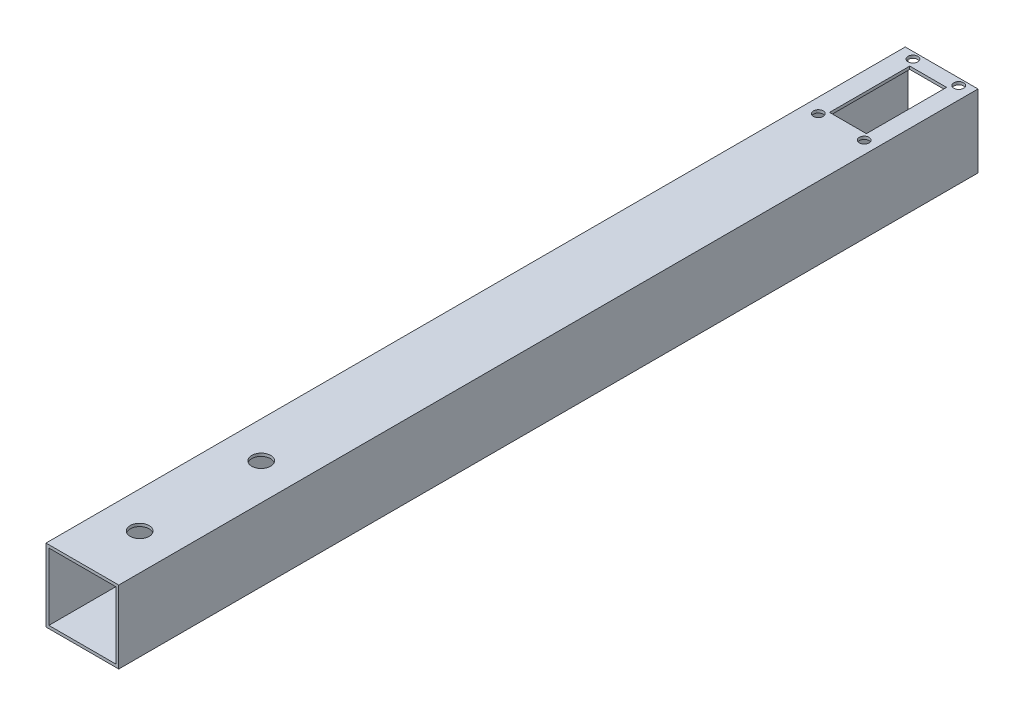
ISO-10303-21;
HEADER;
FILE_DESCRIPTION(('STEP AP214'),'2;1');
FILE_NAME('part.step','',(''),(''),'','','');
FILE_SCHEMA(('AUTOMOTIVE_DESIGN { 1 0 10303 214 1 1 1 1 }'));
ENDSEC;
DATA;
#1=APPLICATION_CONTEXT('core data for automotive mechanical design processes');
#2=APPLICATION_PROTOCOL_DEFINITION('international standard','automotive_design',2000,#1);
#3=PRODUCT_CONTEXT('',#1,'mechanical');
#4=PRODUCT('Part','Part','',(#3));
#5=PRODUCT_RELATED_PRODUCT_CATEGORY('part','',(#4));
#6=PRODUCT_DEFINITION_FORMATION('','',#4);
#7=PRODUCT_DEFINITION_CONTEXT('part definition',#1,'design');
#8=PRODUCT_DEFINITION('design','',#6,#7);
#9=PRODUCT_DEFINITION_SHAPE('','',#8);
#10=(LENGTH_UNIT() NAMED_UNIT(*) SI_UNIT(.MILLI.,.METRE.));
#11=(NAMED_UNIT(*) PLANE_ANGLE_UNIT() SI_UNIT($,.RADIAN.));
#12=(NAMED_UNIT(*) SI_UNIT($,.STERADIAN.) SOLID_ANGLE_UNIT());
#13=UNCERTAINTY_MEASURE_WITH_UNIT(LENGTH_MEASURE(1.E-05),#10,'distance_accuracy_value','');
#14=(GEOMETRIC_REPRESENTATION_CONTEXT(3) GLOBAL_UNCERTAINTY_ASSIGNED_CONTEXT((#13)) GLOBAL_UNIT_ASSIGNED_CONTEXT((#10,
#11,#12)) REPRESENTATION_CONTEXT('',''));
#15=CARTESIAN_POINT('',(0.,0.,0.));
#16=DIRECTION('',(0.,0.,1.));
#17=DIRECTION('',(1.,0.,0.));
#18=AXIS2_PLACEMENT_3D('',#15,#16,#17);
#19=CARTESIAN_POINT('',(-12.7,12.7,300.));
#20=DIRECTION('',(0.,-1.,0.));
#21=DIRECTION('',(0.,0.,-1.));
#22=AXIS2_PLACEMENT_3D('',#19,#20,#21);
#23=PLANE('',#22);
#24=CARTESIAN_POINT('',(8.30000000000014,12.7,2.32003162419413));
#25=DIRECTION('',(0.,1.,0.));
#26=DIRECTION('',(0.,0.,1.));
#27=AXIS2_PLACEMENT_3D('',#24,#25,#26);
#28=CIRCLE('',#27,1.69999999999999);
#29=CARTESIAN_POINT('',(8.30000000000014,12.7,4.02003162419412));
#30=VERTEX_POINT('',#29);
#31=EDGE_CURVE('E304',#30,#30,#28,.T.);
#32=ORIENTED_EDGE('',*,*,#31,.F.);
#33=EDGE_LOOP('',(#32));
#34=FACE_BOUND('',#33,.T.);
#35=CARTESIAN_POINT('',(-7.69999999999986,12.7,2.32003162419413));
#36=DIRECTION('',(0.,1.,0.));
#37=DIRECTION('',(0.,0.,1.));
#38=AXIS2_PLACEMENT_3D('',#35,#36,#37);
#39=CIRCLE('',#38,1.69999999999999);
#40=CARTESIAN_POINT('',(-7.69999999999986,12.7,4.02003162419412));
#41=VERTEX_POINT('',#40);
#42=EDGE_CURVE('E300',#41,#41,#39,.T.);
#43=ORIENTED_EDGE('',*,*,#42,.F.);
#44=EDGE_LOOP('',(#43));
#45=FACE_BOUND('',#44,.T.);
#46=CARTESIAN_POINT('',(-7.69999999999987,12.7,35.3408584723593));
#47=DIRECTION('',(0.,1.,0.));
#48=DIRECTION('',(0.,0.,1.));
#49=AXIS2_PLACEMENT_3D('',#46,#47,#48);
#50=CIRCLE('',#49,1.69999999999999);
#51=CARTESIAN_POINT('',(-7.69999999999987,12.7,37.0408584723593));
#52=VERTEX_POINT('',#51);
#53=EDGE_CURVE('E292',#52,#52,#50,.T.);
#54=ORIENTED_EDGE('',*,*,#53,.F.);
#55=EDGE_LOOP('',(#54));
#56=FACE_BOUND('',#55,.T.);
#57=DIRECTION('',(-1.,0.,0.));
#58=VECTOR('',#57,1.);
#59=CARTESIAN_POINT('',(6.73055637719681,12.7,5.00000000000025));
#60=LINE('',#59,#58);
#61=CARTESIAN_POINT('',(6.73055637719681,12.7,5.00000000000022));
#62=VERTEX_POINT('',#61);
#63=CARTESIAN_POINT('',(-6.13055637719656,12.7,5.00000000000025));
#64=VERTEX_POINT('',#63);
#65=EDGE_CURVE('E141',#62,#64,#60,.T.);
#66=ORIENTED_EDGE('',*,*,#65,.F.);
#67=DIRECTION('',(0.,0.,-1.));
#68=VECTOR('',#67,1.);
#69=CARTESIAN_POINT('',(6.73055637719681,12.7,5.00000000000025));
#70=LINE('',#69,#68);
#71=CARTESIAN_POINT('',(6.73055637719682,12.7,33.0000000000002));
#72=VERTEX_POINT('',#71);
#73=EDGE_CURVE('E55',#72,#62,#70,.T.);
#74=ORIENTED_EDGE('',*,*,#73,.F.);
#75=DIRECTION('',(1.,0.,0.));
#76=VECTOR('',#75,1.);
#77=CARTESIAN_POINT('',(6.73055637719682,12.7,33.0000000000002));
#78=LINE('',#77,#76);
#79=CARTESIAN_POINT('',(-6.13055637719656,12.7,33.0000000000002));
#80=VERTEX_POINT('',#79);
#81=EDGE_CURVE('E148',#80,#72,#78,.T.);
#82=ORIENTED_EDGE('',*,*,#81,.F.);
#83=DIRECTION('',(0.,0.,1.));
#84=VECTOR('',#83,1.);
#85=CARTESIAN_POINT('',(-6.13055637719656,12.7,5.00000000000025));
#86=LINE('',#85,#84);
#87=EDGE_CURVE('E131',#64,#80,#86,.T.);
#88=ORIENTED_EDGE('',*,*,#87,.F.);
#89=EDGE_LOOP('',(#66,#74,#82,#88));
#90=FACE_BOUND('',#89,.T.);
#91=CARTESIAN_POINT('',(0.,12.7,280.));
#92=DIRECTION('',(0.,1.,0.));
#93=DIRECTION('',(0.,0.,1.));
#94=AXIS2_PLACEMENT_3D('',#91,#92,#93);
#95=CIRCLE('',#94,3.29999999999999);
#96=CARTESIAN_POINT('',(0.,12.7,283.3));
#97=VERTEX_POINT('',#96);
#98=EDGE_CURVE('E158',#97,#97,#95,.T.);
#99=ORIENTED_EDGE('',*,*,#98,.F.);
#100=EDGE_LOOP('',(#99));
#101=FACE_BOUND('',#100,.T.);
#102=CARTESIAN_POINT('',(0.,12.7,237.57));
#103=DIRECTION('',(0.,1.,0.));
#104=DIRECTION('',(0.,0.,1.));
#105=AXIS2_PLACEMENT_3D('',#102,#103,#104);
#106=CIRCLE('',#105,3.29999999999999);
#107=CARTESIAN_POINT('',(0.,12.7,240.87));
#108=VERTEX_POINT('',#107);
#109=EDGE_CURVE('E170',#108,#108,#106,.T.);
#110=ORIENTED_EDGE('',*,*,#109,.F.);
#111=EDGE_LOOP('',(#110));
#112=FACE_BOUND('',#111,.T.);
#113=DIRECTION('',(-1.,0.,0.));
#114=VECTOR('',#113,1.);
#115=CARTESIAN_POINT('',(-12.7,12.7,0.));
#116=LINE('',#115,#114);
#117=CARTESIAN_POINT('',(12.7,12.7,0.));
#118=VERTEX_POINT('',#117);
#119=CARTESIAN_POINT('',(-12.7,12.7,0.));
#120=VERTEX_POINT('',#119);
#121=EDGE_CURVE('E240',#118,#120,#116,.T.);
#122=ORIENTED_EDGE('',*,*,#121,.T.);
#123=DIRECTION('',(0.,0.,-1.));
#124=VECTOR('',#123,1.);
#125=CARTESIAN_POINT('',(-12.7,12.7,300.));
#126=LINE('',#125,#124);
#127=CARTESIAN_POINT('',(-12.7,12.7,300.));
#128=VERTEX_POINT('',#127);
#129=EDGE_CURVE('E255',#128,#120,#126,.T.);
#130=ORIENTED_EDGE('',*,*,#129,.F.);
#131=DIRECTION('',(-1.,0.,0.));
#132=VECTOR('',#131,1.);
#133=CARTESIAN_POINT('',(-12.7,12.7,300.));
#134=LINE('',#133,#132);
#135=CARTESIAN_POINT('',(12.7,12.7,300.));
#136=VERTEX_POINT('',#135);
#137=EDGE_CURVE('E226',#136,#128,#134,.T.);
#138=ORIENTED_EDGE('',*,*,#137,.F.);
#139=DIRECTION('',(0.,0.,-1.));
#140=VECTOR('',#139,1.);
#141=CARTESIAN_POINT('',(12.7,12.7,300.));
#142=LINE('',#141,#140);
#143=EDGE_CURVE('E259',#136,#118,#142,.T.);
#144=ORIENTED_EDGE('',*,*,#143,.T.);
#145=EDGE_LOOP('',(#122,#130,#138,#144));
#146=FACE_BOUND('',#145,.T.);
#147=CARTESIAN_POINT('',(8.30000000000013,12.7,35.3408584723594));
#148=DIRECTION('',(0.,1.,0.));
#149=DIRECTION('',(0.,0.,1.));
#150=AXIS2_PLACEMENT_3D('',#147,#148,#149);
#151=CIRCLE('',#150,1.69999999999999);
#152=CARTESIAN_POINT('',(8.30000000000013,12.7,37.0408584723593));
#153=VERTEX_POINT('',#152);
#154=EDGE_CURVE('E282',#153,#153,#151,.T.);
#155=ORIENTED_EDGE('',*,*,#154,.F.);
#156=EDGE_LOOP('',(#155));
#157=FACE_BOUND('',#156,.T.);
#158=ADVANCED_FACE('F38',(#34,#45,#56,#90,#101,#112,#146,#157),#23,.F.);
#159=CARTESIAN_POINT('',(0.,0.,300.));
#160=DIRECTION('',(0.,0.,1.));
#161=DIRECTION('',(1.,0.,0.));
#162=AXIS2_PLACEMENT_3D('',#159,#160,#161);
#163=PLANE('',#162);
#164=DIRECTION('',(0.,1.,0.));
#165=VECTOR('',#164,1.);
#166=CARTESIAN_POINT('',(12.7,12.7,300.));
#167=LINE('',#166,#165);
#168=CARTESIAN_POINT('',(12.7,-12.7,300.));
#169=VERTEX_POINT('',#168);
#170=EDGE_CURVE('E222',#169,#136,#167,.T.);
#171=ORIENTED_EDGE('',*,*,#170,.T.);
#172=ORIENTED_EDGE('',*,*,#137,.T.);
#173=DIRECTION('',(0.,-1.,0.));
#174=VECTOR('',#173,1.);
#175=CARTESIAN_POINT('',(-12.7,12.7,300.));
#176=LINE('',#175,#174);
#177=CARTESIAN_POINT('',(-12.7,-12.7,300.));
#178=VERTEX_POINT('',#177);
#179=EDGE_CURVE('E230',#128,#178,#176,.T.);
#180=ORIENTED_EDGE('',*,*,#179,.T.);
#181=DIRECTION('',(1.,0.,0.));
#182=VECTOR('',#181,1.);
#183=CARTESIAN_POINT('',(-12.7,-12.7,300.));
#184=LINE('',#183,#182);
#185=EDGE_CURVE('E233',#178,#169,#184,.T.);
#186=ORIENTED_EDGE('',*,*,#185,.T.);
#187=EDGE_LOOP('',(#171,#172,#180,#186));
#188=FACE_BOUND('',#187,.T.);
#189=DIRECTION('',(-1.,0.,0.));
#190=VECTOR('',#189,1.);
#191=CARTESIAN_POINT('',(-11.7,11.7,300.));
#192=LINE('',#191,#190);
#193=CARTESIAN_POINT('',(11.7,11.7,300.));
#194=VERTEX_POINT('',#193);
#195=CARTESIAN_POINT('',(-11.7,11.7,300.));
#196=VERTEX_POINT('',#195);
#197=EDGE_CURVE('E182',#194,#196,#192,.T.);
#198=ORIENTED_EDGE('',*,*,#197,.F.);
#199=DIRECTION('',(0.,1.,0.));
#200=VECTOR('',#199,1.);
#201=CARTESIAN_POINT('',(11.7,11.7,300.));
#202=LINE('',#201,#200);
#203=CARTESIAN_POINT('',(11.7,-11.7,300.));
#204=VERTEX_POINT('',#203);
#205=EDGE_CURVE('E179',#204,#194,#202,.T.);
#206=ORIENTED_EDGE('',*,*,#205,.F.);
#207=DIRECTION('',(1.,0.,0.));
#208=VECTOR('',#207,1.);
#209=CARTESIAN_POINT('',(-11.7,-11.7,300.));
#210=LINE('',#209,#208);
#211=CARTESIAN_POINT('',(-11.7,-11.7,300.));
#212=VERTEX_POINT('',#211);
#213=EDGE_CURVE('E190',#212,#204,#210,.T.);
#214=ORIENTED_EDGE('',*,*,#213,.F.);
#215=DIRECTION('',(0.,-1.,0.));
#216=VECTOR('',#215,1.);
#217=CARTESIAN_POINT('',(-11.7,11.7,300.));
#218=LINE('',#217,#216);
#219=EDGE_CURVE('E186',#196,#212,#218,.T.);
#220=ORIENTED_EDGE('',*,*,#219,.F.);
#221=EDGE_LOOP('',(#198,#206,#214,#220));
#222=FACE_BOUND('',#221,.T.);
#223=ADVANCED_FACE('F334',(#188,#222),#163,.T.);
#224=CARTESIAN_POINT('',(0.,0.,0.));
#225=DIRECTION('',(0.,0.,1.));
#226=DIRECTION('',(1.,0.,0.));
#227=AXIS2_PLACEMENT_3D('',#224,#225,#226);
#228=PLANE('',#227);
#229=DIRECTION('',(0.,1.,0.));
#230=VECTOR('',#229,1.);
#231=CARTESIAN_POINT('',(12.7,12.7,0.));
#232=LINE('',#231,#230);
#233=CARTESIAN_POINT('',(12.7,-12.7,0.));
#234=VERTEX_POINT('',#233);
#235=EDGE_CURVE('E221',#234,#118,#232,.T.);
#236=ORIENTED_EDGE('',*,*,#235,.F.);
#237=DIRECTION('',(1.,0.,0.));
#238=VECTOR('',#237,1.);
#239=CARTESIAN_POINT('',(-12.7,-12.7,0.));
#240=LINE('',#239,#238);
#241=CARTESIAN_POINT('',(-12.7,-12.7,0.));
#242=VERTEX_POINT('',#241);
#243=EDGE_CURVE('E227',#242,#234,#240,.T.);
#244=ORIENTED_EDGE('',*,*,#243,.F.);
#245=DIRECTION('',(0.,-1.,0.));
#246=VECTOR('',#245,1.);
#247=CARTESIAN_POINT('',(-12.7,12.7,0.));
#248=LINE('',#247,#246);
#249=EDGE_CURVE('E243',#120,#242,#248,.T.);
#250=ORIENTED_EDGE('',*,*,#249,.F.);
#251=ORIENTED_EDGE('',*,*,#121,.F.);
#252=EDGE_LOOP('',(#236,#244,#250,#251));
#253=FACE_BOUND('',#252,.T.);
#254=DIRECTION('',(0.,1.,0.));
#255=VECTOR('',#254,1.);
#256=CARTESIAN_POINT('',(11.7,11.7,0.));
#257=LINE('',#256,#255);
#258=CARTESIAN_POINT('',(11.7,-11.7,0.));
#259=VERTEX_POINT('',#258);
#260=CARTESIAN_POINT('',(11.7,11.7,0.));
#261=VERTEX_POINT('',#260);
#262=EDGE_CURVE('E178',#259,#261,#257,.T.);
#263=ORIENTED_EDGE('',*,*,#262,.T.);
#264=DIRECTION('',(-1.,0.,0.));
#265=VECTOR('',#264,1.);
#266=CARTESIAN_POINT('',(-11.7,11.7,0.));
#267=LINE('',#266,#265);
#268=CARTESIAN_POINT('',(-11.7,11.7,0.));
#269=VERTEX_POINT('',#268);
#270=EDGE_CURVE('E197',#261,#269,#267,.T.);
#271=ORIENTED_EDGE('',*,*,#270,.T.);
#272=DIRECTION('',(0.,-1.,0.));
#273=VECTOR('',#272,1.);
#274=CARTESIAN_POINT('',(-11.7,11.7,0.));
#275=LINE('',#274,#273);
#276=CARTESIAN_POINT('',(-11.7,-11.7,0.));
#277=VERTEX_POINT('',#276);
#278=EDGE_CURVE('E201',#269,#277,#275,.T.);
#279=ORIENTED_EDGE('',*,*,#278,.T.);
#280=DIRECTION('',(1.,0.,0.));
#281=VECTOR('',#280,1.);
#282=CARTESIAN_POINT('',(-11.7,-11.7,0.));
#283=LINE('',#282,#281);
#284=EDGE_CURVE('E183',#277,#259,#283,.T.);
#285=ORIENTED_EDGE('',*,*,#284,.T.);
#286=EDGE_LOOP('',(#263,#271,#279,#285));
#287=FACE_BOUND('',#286,.T.);
#288=ADVANCED_FACE('F340',(#253,#287),#228,.F.);
#289=CARTESIAN_POINT('',(12.7,12.7,300.));
#290=DIRECTION('',(-1.,0.,0.));
#291=DIRECTION('',(0.,0.,1.));
#292=AXIS2_PLACEMENT_3D('',#289,#290,#291);
#293=PLANE('',#292);
#294=ORIENTED_EDGE('',*,*,#235,.T.);
#295=ORIENTED_EDGE('',*,*,#143,.F.);
#296=ORIENTED_EDGE('',*,*,#170,.F.);
#297=DIRECTION('',(0.,0.,-1.));
#298=VECTOR('',#297,1.);
#299=CARTESIAN_POINT('',(12.7,-12.7,300.));
#300=LINE('',#299,#298);
#301=EDGE_CURVE('E236',#169,#234,#300,.T.);
#302=ORIENTED_EDGE('',*,*,#301,.T.);
#303=EDGE_LOOP('',(#294,#295,#296,#302));
#304=FACE_BOUND('',#303,.T.);
#305=ADVANCED_FACE('F40',(#304),#293,.F.);
#306=CARTESIAN_POINT('',(-12.7,12.7,300.));
#307=DIRECTION('',(1.,0.,0.));
#308=DIRECTION('',(0.,1.,0.));
#309=AXIS2_PLACEMENT_3D('',#306,#307,#308);
#310=PLANE('',#309);
#311=ORIENTED_EDGE('',*,*,#249,.T.);
#312=DIRECTION('',(0.,0.,-1.));
#313=VECTOR('',#312,1.);
#314=CARTESIAN_POINT('',(-12.7,-12.7,300.));
#315=LINE('',#314,#313);
#316=EDGE_CURVE('E251',#178,#242,#315,.T.);
#317=ORIENTED_EDGE('',*,*,#316,.F.);
#318=ORIENTED_EDGE('',*,*,#179,.F.);
#319=ORIENTED_EDGE('',*,*,#129,.T.);
#320=EDGE_LOOP('',(#311,#317,#318,#319));
#321=FACE_BOUND('',#320,.T.);
#322=ADVANCED_FACE('F345',(#321),#310,.F.);
#323=CARTESIAN_POINT('',(-12.7,-12.7,300.));
#324=DIRECTION('',(0.,1.,0.));
#325=DIRECTION('',(0.,0.,1.));
#326=AXIS2_PLACEMENT_3D('',#323,#324,#325);
#327=PLANE('',#326);
#328=ORIENTED_EDGE('',*,*,#243,.T.);
#329=ORIENTED_EDGE('',*,*,#301,.F.);
#330=ORIENTED_EDGE('',*,*,#185,.F.);
#331=ORIENTED_EDGE('',*,*,#316,.T.);
#332=EDGE_LOOP('',(#328,#329,#330,#331));
#333=FACE_BOUND('',#332,.T.);
#334=ADVANCED_FACE('F348',(#333),#327,.F.);
#335=CARTESIAN_POINT('',(11.7,11.7,300.));
#336=DIRECTION('',(-1.,0.,0.));
#337=DIRECTION('',(0.,-1.,0.));
#338=AXIS2_PLACEMENT_3D('',#335,#336,#337);
#339=PLANE('',#338);
#340=ORIENTED_EDGE('',*,*,#262,.F.);
#341=DIRECTION('',(0.,0.,-1.));
#342=VECTOR('',#341,1.);
#343=CARTESIAN_POINT('',(11.7,-11.7,300.));
#344=LINE('',#343,#342);
#345=EDGE_CURVE('E193',#204,#259,#344,.T.);
#346=ORIENTED_EDGE('',*,*,#345,.F.);
#347=ORIENTED_EDGE('',*,*,#205,.T.);
#348=DIRECTION('',(0.,0.,-1.));
#349=VECTOR('',#348,1.);
#350=CARTESIAN_POINT('',(11.7,11.7,300.));
#351=LINE('',#350,#349);
#352=EDGE_CURVE('E217',#194,#261,#351,.T.);
#353=ORIENTED_EDGE('',*,*,#352,.T.);
#354=EDGE_LOOP('',(#340,#346,#347,#353));
#355=FACE_BOUND('',#354,.T.);
#356=ADVANCED_FACE('F318',(#355),#339,.T.);
#357=CARTESIAN_POINT('',(-11.7,11.7,300.));
#358=DIRECTION('',(0.,-1.,0.));
#359=DIRECTION('',(0.,0.,-1.));
#360=AXIS2_PLACEMENT_3D('',#357,#358,#359);
#361=PLANE('',#360);
#362=CARTESIAN_POINT('',(8.30000000000014,11.7,2.32003162419413));
#363=DIRECTION('',(0.,-1.,0.));
#364=DIRECTION('',(0.,0.,-1.));
#365=AXIS2_PLACEMENT_3D('',#362,#363,#364);
#366=CIRCLE('',#365,1.69999999999999);
#367=CARTESIAN_POINT('',(8.30000000000014,11.7,0.620031624194145));
#368=VERTEX_POINT('',#367);
#369=EDGE_CURVE('E42',#368,#368,#366,.T.);
#370=ORIENTED_EDGE('',*,*,#369,.F.);
#371=EDGE_LOOP('',(#370));
#372=FACE_BOUND('',#371,.T.);
#373=CARTESIAN_POINT('',(-7.69999999999986,11.7,2.32003162419413));
#374=DIRECTION('',(0.,-1.,0.));
#375=DIRECTION('',(0.,0.,-1.));
#376=AXIS2_PLACEMENT_3D('',#373,#374,#375);
#377=CIRCLE('',#376,1.69999999999999);
#378=CARTESIAN_POINT('',(-7.69999999999986,11.7,0.620031624194138));
#379=VERTEX_POINT('',#378);
#380=EDGE_CURVE('E296',#379,#379,#377,.T.);
#381=ORIENTED_EDGE('',*,*,#380,.F.);
#382=EDGE_LOOP('',(#381));
#383=FACE_BOUND('',#382,.T.);
#384=CARTESIAN_POINT('',(-7.69999999999987,11.7,35.3408584723593));
#385=DIRECTION('',(0.,-1.,0.));
#386=DIRECTION('',(0.,0.,-1.));
#387=AXIS2_PLACEMENT_3D('',#384,#385,#386);
#388=CIRCLE('',#387,1.69999999999999);
#389=CARTESIAN_POINT('',(-7.69999999999987,11.7,33.6408584723594));
#390=VERTEX_POINT('',#389);
#391=EDGE_CURVE('E288',#390,#390,#388,.T.);
#392=ORIENTED_EDGE('',*,*,#391,.F.);
#393=EDGE_LOOP('',(#392));
#394=FACE_BOUND('',#393,.T.);
#395=CARTESIAN_POINT('',(8.30000000000013,11.7,35.3408584723594));
#396=DIRECTION('',(0.,-1.,0.));
#397=DIRECTION('',(0.,0.,-1.));
#398=AXIS2_PLACEMENT_3D('',#395,#396,#397);
#399=CIRCLE('',#398,1.69999999999999);
#400=CARTESIAN_POINT('',(8.30000000000013,11.7,33.6408584723594));
#401=VERTEX_POINT('',#400);
#402=EDGE_CURVE('E279',#401,#401,#399,.T.);
#403=ORIENTED_EDGE('',*,*,#402,.F.);
#404=EDGE_LOOP('',(#403));
#405=FACE_BOUND('',#404,.T.);
#406=DIRECTION('',(0.,0.,1.));
#407=VECTOR('',#406,1.);
#408=CARTESIAN_POINT('',(6.73055637719685,11.7,300.));
#409=LINE('',#408,#407);
#410=CARTESIAN_POINT('',(6.73055637719681,11.7,5.00000000000025));
#411=VERTEX_POINT('',#410);
#412=CARTESIAN_POINT('',(6.73055637719682,11.7,33.0000000000002));
#413=VERTEX_POINT('',#412);
#414=EDGE_CURVE('E11',#411,#413,#409,.T.);
#415=ORIENTED_EDGE('',*,*,#414,.F.);
#416=DIRECTION('',(1.,0.,0.));
#417=VECTOR('',#416,1.);
#418=CARTESIAN_POINT('',(-11.7,11.7,5.00000000000023));
#419=LINE('',#418,#417);
#420=CARTESIAN_POINT('',(-6.13055637719656,11.7,5.00000000000023));
#421=VERTEX_POINT('',#420);
#422=EDGE_CURVE('E263',#421,#411,#419,.T.);
#423=ORIENTED_EDGE('',*,*,#422,.F.);
#424=DIRECTION('',(0.,0.,-1.));
#425=VECTOR('',#424,1.);
#426=CARTESIAN_POINT('',(-6.13055637719651,11.7,300.));
#427=LINE('',#426,#425);
#428=CARTESIAN_POINT('',(-6.13055637719656,11.7,33.0000000000002));
#429=VERTEX_POINT('',#428);
#430=EDGE_CURVE('E134',#429,#421,#427,.T.);
#431=ORIENTED_EDGE('',*,*,#430,.F.);
#432=DIRECTION('',(-1.,0.,0.));
#433=VECTOR('',#432,1.);
#434=CARTESIAN_POINT('',(-11.7,11.7,33.0000000000002));
#435=LINE('',#434,#433);
#436=EDGE_CURVE('E48',#413,#429,#435,.T.);
#437=ORIENTED_EDGE('',*,*,#436,.F.);
#438=EDGE_LOOP('',(#415,#423,#431,#437));
#439=FACE_BOUND('',#438,.T.);
#440=CARTESIAN_POINT('',(0.,11.7,280.));
#441=DIRECTION('',(0.,-1.,0.));
#442=DIRECTION('',(0.,0.,-1.));
#443=AXIS2_PLACEMENT_3D('',#440,#441,#442);
#444=CIRCLE('',#443,3.29999999999999);
#445=CARTESIAN_POINT('',(0.,11.7,276.7));
#446=VERTEX_POINT('',#445);
#447=EDGE_CURVE('E166',#446,#446,#444,.T.);
#448=ORIENTED_EDGE('',*,*,#447,.F.);
#449=EDGE_LOOP('',(#448));
#450=FACE_BOUND('',#449,.T.);
#451=CARTESIAN_POINT('',(0.,11.7,237.57));
#452=DIRECTION('',(0.,-1.,0.));
#453=DIRECTION('',(0.,0.,-1.));
#454=AXIS2_PLACEMENT_3D('',#451,#452,#453);
#455=CIRCLE('',#454,3.29999999999999);
#456=CARTESIAN_POINT('',(0.,11.7,234.27));
#457=VERTEX_POINT('',#456);
#458=EDGE_CURVE('E174',#457,#457,#455,.T.);
#459=ORIENTED_EDGE('',*,*,#458,.F.);
#460=EDGE_LOOP('',(#459));
#461=FACE_BOUND('',#460,.T.);
#462=ORIENTED_EDGE('',*,*,#270,.F.);
#463=ORIENTED_EDGE('',*,*,#352,.F.);
#464=ORIENTED_EDGE('',*,*,#197,.T.);
#465=DIRECTION('',(0.,0.,-1.));
#466=VECTOR('',#465,1.);
#467=CARTESIAN_POINT('',(-11.7,11.7,300.));
#468=LINE('',#467,#466);
#469=EDGE_CURVE('E214',#196,#269,#468,.T.);
#470=ORIENTED_EDGE('',*,*,#469,.T.);
#471=EDGE_LOOP('',(#462,#463,#464,#470));
#472=FACE_BOUND('',#471,.T.);
#473=ADVANCED_FACE('F275',(#372,#383,#394,#405,#439,#450,#461,#472),#361,.T.);
#474=CARTESIAN_POINT('',(-11.7,11.7,300.));
#475=DIRECTION('',(1.,0.,0.));
#476=DIRECTION('',(0.,1.,0.));
#477=AXIS2_PLACEMENT_3D('',#474,#475,#476);
#478=PLANE('',#477);
#479=ORIENTED_EDGE('',*,*,#278,.F.);
#480=ORIENTED_EDGE('',*,*,#469,.F.);
#481=ORIENTED_EDGE('',*,*,#219,.T.);
#482=DIRECTION('',(0.,0.,-1.));
#483=VECTOR('',#482,1.);
#484=CARTESIAN_POINT('',(-11.7,-11.7,300.));
#485=LINE('',#484,#483);
#486=EDGE_CURVE('E211',#212,#277,#485,.T.);
#487=ORIENTED_EDGE('',*,*,#486,.T.);
#488=EDGE_LOOP('',(#479,#480,#481,#487));
#489=FACE_BOUND('',#488,.T.);
#490=ADVANCED_FACE('F317',(#489),#478,.T.);
#491=CARTESIAN_POINT('',(-11.7,-11.7,300.));
#492=DIRECTION('',(0.,1.,0.));
#493=DIRECTION('',(0.,0.,1.));
#494=AXIS2_PLACEMENT_3D('',#491,#492,#493);
#495=PLANE('',#494);
#496=ORIENTED_EDGE('',*,*,#284,.F.);
#497=ORIENTED_EDGE('',*,*,#486,.F.);
#498=ORIENTED_EDGE('',*,*,#213,.T.);
#499=ORIENTED_EDGE('',*,*,#345,.T.);
#500=EDGE_LOOP('',(#496,#497,#498,#499));
#501=FACE_BOUND('',#500,.T.);
#502=ADVANCED_FACE('F361',(#501),#495,.T.);
#503=CARTESIAN_POINT('',(0.,12.7,237.57));
#504=DIRECTION('',(0.,1.,0.));
#505=DIRECTION('',(0.,0.,1.));
#506=AXIS2_PLACEMENT_3D('',#503,#504,#505);
#507=CYLINDRICAL_SURFACE('',#506,3.29999999999999);
#508=ORIENTED_EDGE('',*,*,#458,.T.);
#509=EDGE_LOOP('',(#508));
#510=FACE_BOUND('',#509,.T.);
#511=ORIENTED_EDGE('',*,*,#109,.T.);
#512=EDGE_LOOP('',(#511));
#513=FACE_BOUND('',#512,.T.);
#514=ADVANCED_FACE('F365',(#510,#513),#507,.F.);
#515=CARTESIAN_POINT('',(0.,12.7,280.));
#516=DIRECTION('',(0.,1.,0.));
#517=DIRECTION('',(0.,0.,1.));
#518=AXIS2_PLACEMENT_3D('',#515,#516,#517);
#519=CYLINDRICAL_SURFACE('',#518,3.29999999999999);
#520=ORIENTED_EDGE('',*,*,#447,.T.);
#521=EDGE_LOOP('',(#520));
#522=FACE_BOUND('',#521,.T.);
#523=ORIENTED_EDGE('',*,*,#98,.T.);
#524=EDGE_LOOP('',(#523));
#525=FACE_BOUND('',#524,.T.);
#526=ADVANCED_FACE('F369',(#522,#525),#519,.F.);
#527=CARTESIAN_POINT('',(6.73055637719681,2.7,5.00000000000025));
#528=DIRECTION('',(1.,0.,0.));
#529=DIRECTION('',(0.,0.,-1.));
#530=AXIS2_PLACEMENT_3D('',#527,#528,#529);
#531=PLANE('',#530);
#532=ORIENTED_EDGE('',*,*,#414,.T.);
#533=DIRECTION('',(0.,1.,0.));
#534=VECTOR('',#533,1.);
#535=CARTESIAN_POINT('',(6.73055637719682,2.7,33.0000000000002));
#536=LINE('',#535,#534);
#537=EDGE_CURVE('E155',#413,#72,#536,.T.);
#538=ORIENTED_EDGE('',*,*,#537,.T.);
#539=ORIENTED_EDGE('',*,*,#73,.T.);
#540=DIRECTION('',(0.,1.,0.));
#541=VECTOR('',#540,1.);
#542=CARTESIAN_POINT('',(6.73055637719681,2.7,5.00000000000025));
#543=LINE('',#542,#541);
#544=EDGE_CURVE('E138',#411,#62,#543,.T.);
#545=ORIENTED_EDGE('',*,*,#544,.F.);
#546=EDGE_LOOP('',(#532,#538,#539,#545));
#547=FACE_BOUND('',#546,.T.);
#548=ADVANCED_FACE('F277',(#547),#531,.F.);
#549=CARTESIAN_POINT('',(6.73055637719682,2.7,33.0000000000002));
#550=DIRECTION('',(0.,0.,1.));
#551=DIRECTION('',(1.,0.,0.));
#552=AXIS2_PLACEMENT_3D('',#549,#550,#551);
#553=PLANE('',#552);
#554=ORIENTED_EDGE('',*,*,#436,.T.);
#555=DIRECTION('',(0.,1.,0.));
#556=VECTOR('',#555,1.);
#557=CARTESIAN_POINT('',(-6.13055637719656,2.7,33.0000000000002));
#558=LINE('',#557,#556);
#559=EDGE_CURVE('E137',#429,#80,#558,.T.);
#560=ORIENTED_EDGE('',*,*,#559,.T.);
#561=ORIENTED_EDGE('',*,*,#81,.T.);
#562=ORIENTED_EDGE('',*,*,#537,.F.);
#563=EDGE_LOOP('',(#554,#560,#561,#562));
#564=FACE_BOUND('',#563,.T.);
#565=ADVANCED_FACE('F272',(#564),#553,.F.);
#566=CARTESIAN_POINT('',(-6.13055637719656,2.7,5.00000000000025));
#567=DIRECTION('',(-1.,0.,0.));
#568=DIRECTION('',(0.,0.,1.));
#569=AXIS2_PLACEMENT_3D('',#566,#567,#568);
#570=PLANE('',#569);
#571=ORIENTED_EDGE('',*,*,#430,.T.);
#572=DIRECTION('',(0.,1.,0.));
#573=VECTOR('',#572,1.);
#574=CARTESIAN_POINT('',(-6.13055637719656,2.7,5.00000000000025));
#575=LINE('',#574,#573);
#576=EDGE_CURVE('E63',#421,#64,#575,.T.);
#577=ORIENTED_EDGE('',*,*,#576,.T.);
#578=ORIENTED_EDGE('',*,*,#87,.T.);
#579=ORIENTED_EDGE('',*,*,#559,.F.);
#580=EDGE_LOOP('',(#571,#577,#578,#579));
#581=FACE_BOUND('',#580,.T.);
#582=ADVANCED_FACE('F128',(#581),#570,.F.);
#583=CARTESIAN_POINT('',(6.73055637719681,2.7,5.00000000000025));
#584=DIRECTION('',(0.,0.,-1.));
#585=DIRECTION('',(-1.,0.,0.));
#586=AXIS2_PLACEMENT_3D('',#583,#584,#585);
#587=PLANE('',#586);
#588=ORIENTED_EDGE('',*,*,#422,.T.);
#589=ORIENTED_EDGE('',*,*,#544,.T.);
#590=ORIENTED_EDGE('',*,*,#65,.T.);
#591=ORIENTED_EDGE('',*,*,#576,.F.);
#592=EDGE_LOOP('',(#588,#589,#590,#591));
#593=FACE_BOUND('',#592,.T.);
#594=ADVANCED_FACE('F142',(#593),#587,.F.);
#595=CARTESIAN_POINT('',(8.30000000000013,12.7,35.3408584723594));
#596=DIRECTION('',(0.,1.,0.));
#597=DIRECTION('',(0.,0.,1.));
#598=AXIS2_PLACEMENT_3D('',#595,#596,#597);
#599=CYLINDRICAL_SURFACE('',#598,1.69999999999999);
#600=ORIENTED_EDGE('',*,*,#402,.T.);
#601=EDGE_LOOP('',(#600));
#602=FACE_BOUND('',#601,.T.);
#603=ORIENTED_EDGE('',*,*,#154,.T.);
#604=EDGE_LOOP('',(#603));
#605=FACE_BOUND('',#604,.T.);
#606=ADVANCED_FACE('F326',(#602,#605),#599,.F.);
#607=CARTESIAN_POINT('',(-7.69999999999987,12.7,35.3408584723593));
#608=DIRECTION('',(0.,1.,0.));
#609=DIRECTION('',(0.,0.,1.));
#610=AXIS2_PLACEMENT_3D('',#607,#608,#609);
#611=CYLINDRICAL_SURFACE('',#610,1.69999999999999);
#612=ORIENTED_EDGE('',*,*,#391,.T.);
#613=EDGE_LOOP('',(#612));
#614=FACE_BOUND('',#613,.T.);
#615=ORIENTED_EDGE('',*,*,#53,.T.);
#616=EDGE_LOOP('',(#615));
#617=FACE_BOUND('',#616,.T.);
#618=ADVANCED_FACE('F329',(#614,#617),#611,.F.);
#619=CARTESIAN_POINT('',(-7.69999999999986,12.7,2.32003162419413));
#620=DIRECTION('',(0.,1.,0.));
#621=DIRECTION('',(0.,0.,1.));
#622=AXIS2_PLACEMENT_3D('',#619,#620,#621);
#623=CYLINDRICAL_SURFACE('',#622,1.69999999999999);
#624=ORIENTED_EDGE('',*,*,#380,.T.);
#625=EDGE_LOOP('',(#624));
#626=FACE_BOUND('',#625,.T.);
#627=ORIENTED_EDGE('',*,*,#42,.T.);
#628=EDGE_LOOP('',(#627));
#629=FACE_BOUND('',#628,.T.);
#630=ADVANCED_FACE('F384',(#626,#629),#623,.F.);
#631=CARTESIAN_POINT('',(8.30000000000014,12.7,2.32003162419413));
#632=DIRECTION('',(0.,1.,0.));
#633=DIRECTION('',(0.,0.,1.));
#634=AXIS2_PLACEMENT_3D('',#631,#632,#633);
#635=CYLINDRICAL_SURFACE('',#634,1.69999999999999);
#636=ORIENTED_EDGE('',*,*,#369,.T.);
#637=EDGE_LOOP('',(#636));
#638=FACE_BOUND('',#637,.T.);
#639=ORIENTED_EDGE('',*,*,#31,.T.);
#640=EDGE_LOOP('',(#639));
#641=FACE_BOUND('',#640,.T.);
#642=ADVANCED_FACE('F313',(#638,#641),#635,.F.);
#643=CLOSED_SHELL('',(#158,#223,#288,#305,#322,#334,#356,#473,#490,#502,#514,#526,#548,#565,
#582,#594,#606,#618,#630,#642));
#644=MANIFOLD_SOLID_BREP('B2',#643);
#645=ADVANCED_BREP_SHAPE_REPRESENTATION('',(#18,#644),#14);
#646=SHAPE_DEFINITION_REPRESENTATION(#9,#645);
ENDSEC;
END-ISO-10303-21;
